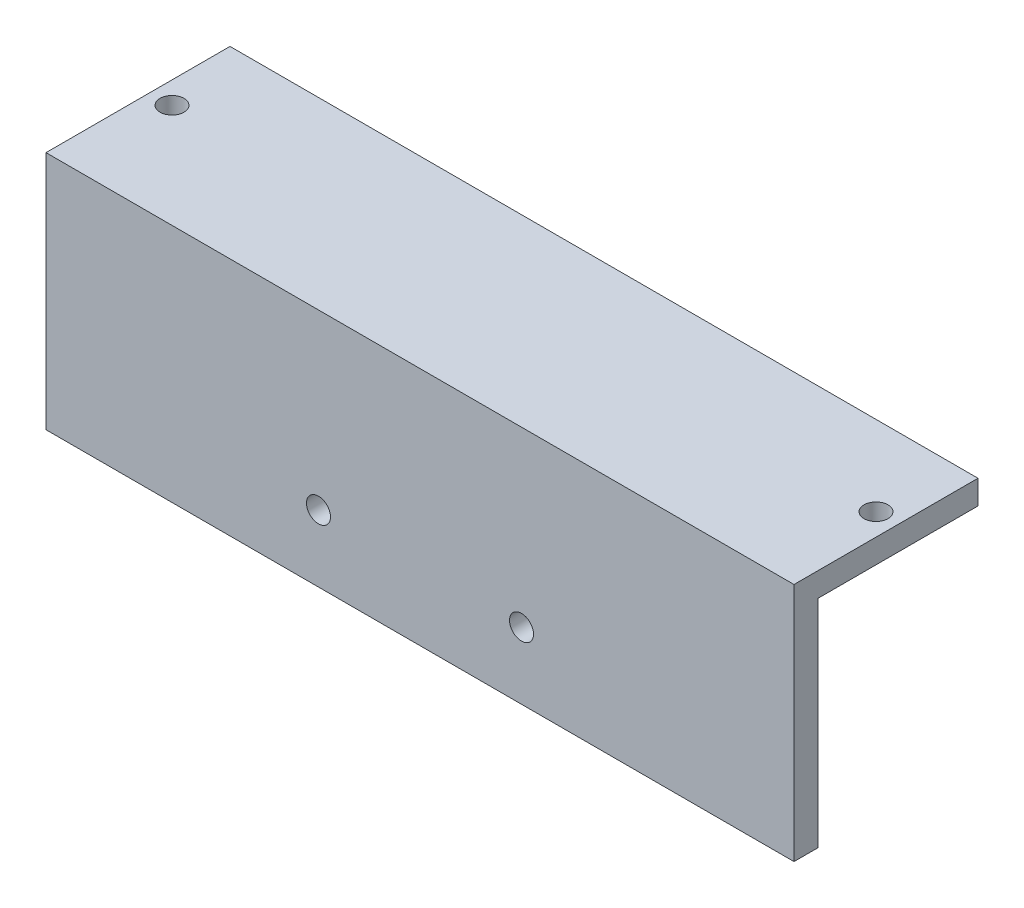
ISO-10303-21;
HEADER;
FILE_DESCRIPTION(('STEP AP214'),'2;1');
FILE_NAME('part.step','',(''),(''),'','','');
FILE_SCHEMA(('AUTOMOTIVE_DESIGN { 1 0 10303 214 1 1 1 1 }'));
ENDSEC;
DATA;
#1=APPLICATION_CONTEXT('core data for automotive mechanical design processes');
#2=APPLICATION_PROTOCOL_DEFINITION('international standard','automotive_design',2000,#1);
#3=PRODUCT_CONTEXT('',#1,'mechanical');
#4=PRODUCT('Part','Part','',(#3));
#5=PRODUCT_RELATED_PRODUCT_CATEGORY('part','',(#4));
#6=PRODUCT_DEFINITION_FORMATION('','',#4);
#7=PRODUCT_DEFINITION_CONTEXT('part definition',#1,'design');
#8=PRODUCT_DEFINITION('design','',#6,#7);
#9=PRODUCT_DEFINITION_SHAPE('','',#8);
#10=(LENGTH_UNIT() NAMED_UNIT(*) SI_UNIT(.MILLI.,.METRE.));
#11=(NAMED_UNIT(*) PLANE_ANGLE_UNIT() SI_UNIT($,.RADIAN.));
#12=(NAMED_UNIT(*) SI_UNIT($,.STERADIAN.) SOLID_ANGLE_UNIT());
#13=UNCERTAINTY_MEASURE_WITH_UNIT(LENGTH_MEASURE(1.E-05),#10,'distance_accuracy_value','');
#14=(GEOMETRIC_REPRESENTATION_CONTEXT(3) GLOBAL_UNCERTAINTY_ASSIGNED_CONTEXT((#13)) GLOBAL_UNIT_ASSIGNED_CONTEXT((#10,
#11,#12)) REPRESENTATION_CONTEXT('',''));
#15=CARTESIAN_POINT('',(0.,0.,0.));
#16=DIRECTION('',(0.,0.,1.));
#17=DIRECTION('',(1.,0.,0.));
#18=AXIS2_PLACEMENT_3D('',#15,#16,#17);
#19=CARTESIAN_POINT('',(0.,0.,0.));
#20=DIRECTION('',(0.,0.,1.));
#21=DIRECTION('',(1.,0.,0.));
#22=AXIS2_PLACEMENT_3D('',#19,#20,#21);
#23=PLANE('',#22);
#24=CARTESIAN_POINT('',(40.8435087719298,-10.3434536390915,0.));
#25=DIRECTION('',(0.,0.,-1.));
#26=DIRECTION('',(-1.,0.,0.));
#27=AXIS2_PLACEMENT_3D('',#24,#25,#26);
#28=CIRCLE('',#27,1.5);
#29=CARTESIAN_POINT('',(39.3435087719298,-10.3434536390915,0.));
#30=VERTEX_POINT('',#29);
#31=EDGE_CURVE('E169',#30,#30,#28,.T.);
#32=ORIENTED_EDGE('',*,*,#31,.F.);
#33=EDGE_LOOP('',(#32));
#34=FACE_BOUND('',#33,.T.);
#35=CARTESIAN_POINT('',(15.4635087719298,-10.3434536390915,0.));
#36=DIRECTION('',(0.,0.,-1.));
#37=DIRECTION('',(-1.,0.,0.));
#38=AXIS2_PLACEMENT_3D('',#35,#36,#37);
#39=CIRCLE('',#38,1.5);
#40=CARTESIAN_POINT('',(13.9635087719298,-10.3434536390915,0.));
#41=VERTEX_POINT('',#40);
#42=EDGE_CURVE('E177',#41,#41,#39,.T.);
#43=ORIENTED_EDGE('',*,*,#42,.F.);
#44=EDGE_LOOP('',(#43));
#45=FACE_BOUND('',#44,.T.);
#46=DIRECTION('',(-1.,0.,0.));
#47=VECTOR('',#46,1.);
#48=CARTESIAN_POINT('',(-18.5964912280702,8.31578947368421,0.));
#49=LINE('',#48,#47);
#50=CARTESIAN_POINT('',(74.9035087719298,8.3157894736842,0.));
#51=VERTEX_POINT('',#50);
#52=CARTESIAN_POINT('',(-18.5964912280702,8.31578947368421,0.));
#53=VERTEX_POINT('',#52);
#54=EDGE_CURVE('E57',#51,#53,#49,.T.);
#55=ORIENTED_EDGE('',*,*,#54,.F.);
#56=DIRECTION('',(0.,1.,0.));
#57=VECTOR('',#56,1.);
#58=CARTESIAN_POINT('',(74.9035087719298,11.3157894736842,0.));
#59=LINE('',#58,#57);
#60=CARTESIAN_POINT('',(74.9035087719298,-18.6842105263158,0.));
#61=VERTEX_POINT('',#60);
#62=EDGE_CURVE('E149',#61,#51,#59,.T.);
#63=ORIENTED_EDGE('',*,*,#62,.F.);
#64=DIRECTION('',(1.,0.,0.));
#65=VECTOR('',#64,1.);
#66=CARTESIAN_POINT('',(-18.5964912280702,-18.6842105263158,0.));
#67=LINE('',#66,#65);
#68=CARTESIAN_POINT('',(-18.5964912280702,-18.6842105263158,0.));
#69=VERTEX_POINT('',#68);
#70=EDGE_CURVE('E81',#69,#61,#67,.T.);
#71=ORIENTED_EDGE('',*,*,#70,.F.);
#72=DIRECTION('',(0.,-1.,0.));
#73=VECTOR('',#72,1.);
#74=CARTESIAN_POINT('',(-18.5964912280702,11.3157894736842,0.));
#75=LINE('',#74,#73);
#76=EDGE_CURVE('E146',#53,#69,#75,.T.);
#77=ORIENTED_EDGE('',*,*,#76,.F.);
#78=EDGE_LOOP('',(#55,#63,#71,#77));
#79=FACE_BOUND('',#78,.T.);
#80=ADVANCED_FACE('F39',(#34,#45,#79),#23,.F.);
#81=CARTESIAN_POINT('',(-18.5964912280702,11.3157894736842,3.));
#82=DIRECTION('',(1.,0.,0.));
#83=DIRECTION('',(0.,1.,0.));
#84=AXIS2_PLACEMENT_3D('',#81,#82,#83);
#85=PLANE('',#84);
#86=DIRECTION('',(0.,0.,-1.));
#87=VECTOR('',#86,1.);
#88=CARTESIAN_POINT('',(-18.5964912280702,11.3157894736842,3.));
#89=LINE('',#88,#87);
#90=CARTESIAN_POINT('',(-18.5964912280702,11.3157894736842,3.));
#91=VERTEX_POINT('',#90);
#92=CARTESIAN_POINT('',(-18.5964912280702,11.3157894736842,-20.));
#93=VERTEX_POINT('',#92);
#94=EDGE_CURVE('E103',#91,#93,#89,.T.);
#95=ORIENTED_EDGE('',*,*,#94,.T.);
#96=DIRECTION('',(0.,1.,0.));
#97=VECTOR('',#96,1.);
#98=CARTESIAN_POINT('',(-18.5964912280702,11.3157894736842,-20.));
#99=LINE('',#98,#97);
#100=CARTESIAN_POINT('',(-18.5964912280702,8.31578947368421,-20.));
#101=VERTEX_POINT('',#100);
#102=EDGE_CURVE('E107',#101,#93,#99,.T.);
#103=ORIENTED_EDGE('',*,*,#102,.F.);
#104=DIRECTION('',(0.,0.,1.));
#105=VECTOR('',#104,1.);
#106=CARTESIAN_POINT('',(-18.5964912280702,8.31578947368421,-20.));
#107=LINE('',#106,#105);
#108=EDGE_CURVE('E138',#101,#53,#107,.T.);
#109=ORIENTED_EDGE('',*,*,#108,.T.);
#110=ORIENTED_EDGE('',*,*,#76,.T.);
#111=DIRECTION('',(0.,0.,-1.));
#112=VECTOR('',#111,1.);
#113=CARTESIAN_POINT('',(-18.5964912280702,-18.6842105263158,3.));
#114=LINE('',#113,#112);
#115=CARTESIAN_POINT('',(-18.5964912280702,-18.6842105263158,3.));
#116=VERTEX_POINT('',#115);
#117=EDGE_CURVE('E11',#116,#69,#114,.T.);
#118=ORIENTED_EDGE('',*,*,#117,.F.);
#119=DIRECTION('',(0.,-1.,0.));
#120=VECTOR('',#119,1.);
#121=CARTESIAN_POINT('',(-18.5964912280702,11.3157894736842,3.));
#122=LINE('',#121,#120);
#123=EDGE_CURVE('E109',#91,#116,#122,.T.);
#124=ORIENTED_EDGE('',*,*,#123,.F.);
#125=EDGE_LOOP('',(#95,#103,#109,#110,#118,#124));
#126=FACE_BOUND('',#125,.T.);
#127=ADVANCED_FACE('F41',(#126),#85,.F.);
#128=CARTESIAN_POINT('',(-18.5964912280702,-18.6842105263158,3.));
#129=DIRECTION('',(0.,1.,0.));
#130=DIRECTION('',(0.,0.,1.));
#131=AXIS2_PLACEMENT_3D('',#128,#129,#130);
#132=PLANE('',#131);
#133=ORIENTED_EDGE('',*,*,#70,.T.);
#134=DIRECTION('',(0.,0.,-1.));
#135=VECTOR('',#134,1.);
#136=CARTESIAN_POINT('',(74.9035087719298,-18.6842105263158,3.));
#137=LINE('',#136,#135);
#138=CARTESIAN_POINT('',(74.9035087719298,-18.6842105263158,3.));
#139=VERTEX_POINT('',#138);
#140=EDGE_CURVE('E49',#139,#61,#137,.T.);
#141=ORIENTED_EDGE('',*,*,#140,.F.);
#142=DIRECTION('',(1.,0.,0.));
#143=VECTOR('',#142,1.);
#144=CARTESIAN_POINT('',(-18.5964912280702,-18.6842105263158,3.));
#145=LINE('',#144,#143);
#146=EDGE_CURVE('E86',#116,#139,#145,.T.);
#147=ORIENTED_EDGE('',*,*,#146,.F.);
#148=ORIENTED_EDGE('',*,*,#117,.T.);
#149=EDGE_LOOP('',(#133,#141,#147,#148));
#150=FACE_BOUND('',#149,.T.);
#151=ADVANCED_FACE('F221',(#150),#132,.F.);
#152=CARTESIAN_POINT('',(74.9035087719298,11.3157894736842,3.));
#153=DIRECTION('',(-1.,0.,0.));
#154=DIRECTION('',(0.,0.,1.));
#155=AXIS2_PLACEMENT_3D('',#152,#153,#154);
#156=PLANE('',#155);
#157=ORIENTED_EDGE('',*,*,#62,.T.);
#158=DIRECTION('',(0.,0.,1.));
#159=VECTOR('',#158,1.);
#160=CARTESIAN_POINT('',(74.9035087719298,8.3157894736842,-20.));
#161=LINE('',#160,#159);
#162=CARTESIAN_POINT('',(74.9035087719298,8.3157894736842,-20.));
#163=VERTEX_POINT('',#162);
#164=EDGE_CURVE('E142',#163,#51,#161,.T.);
#165=ORIENTED_EDGE('',*,*,#164,.F.);
#166=DIRECTION('',(0.,-1.,0.));
#167=VECTOR('',#166,1.);
#168=CARTESIAN_POINT('',(74.9035087719298,11.3157894736842,-20.));
#169=LINE('',#168,#167);
#170=CARTESIAN_POINT('',(74.9035087719298,11.3157894736842,-20.));
#171=VERTEX_POINT('',#170);
#172=EDGE_CURVE('E121',#171,#163,#169,.T.);
#173=ORIENTED_EDGE('',*,*,#172,.F.);
#174=DIRECTION('',(0.,0.,-1.));
#175=VECTOR('',#174,1.);
#176=CARTESIAN_POINT('',(74.9035087719298,11.3157894736842,3.));
#177=LINE('',#176,#175);
#178=CARTESIAN_POINT('',(74.9035087719298,11.3157894736842,3.));
#179=VERTEX_POINT('',#178);
#180=EDGE_CURVE('E112',#179,#171,#177,.T.);
#181=ORIENTED_EDGE('',*,*,#180,.F.);
#182=DIRECTION('',(0.,1.,0.));
#183=VECTOR('',#182,1.);
#184=CARTESIAN_POINT('',(74.9035087719298,11.3157894736842,3.));
#185=LINE('',#184,#183);
#186=EDGE_CURVE('E152',#139,#179,#185,.T.);
#187=ORIENTED_EDGE('',*,*,#186,.F.);
#188=ORIENTED_EDGE('',*,*,#140,.T.);
#189=EDGE_LOOP('',(#157,#165,#173,#181,#187,#188));
#190=FACE_BOUND('',#189,.T.);
#191=ADVANCED_FACE('F229',(#190),#156,.F.);
#192=CARTESIAN_POINT('',(-18.5964912280702,11.3157894736842,3.));
#193=DIRECTION('',(0.,-1.,0.));
#194=DIRECTION('',(0.,0.,-1.));
#195=AXIS2_PLACEMENT_3D('',#192,#193,#194);
#196=PLANE('',#195);
#197=CARTESIAN_POINT('',(-15.8464912280702,11.3157894736842,-10.));
#198=DIRECTION('',(0.,-1.,0.));
#199=DIRECTION('',(0.,0.,-1.));
#200=AXIS2_PLACEMENT_3D('',#197,#198,#199);
#201=CIRCLE('',#200,1.5);
#202=CARTESIAN_POINT('',(-15.8464912280702,11.3157894736842,-11.5));
#203=VERTEX_POINT('',#202);
#204=EDGE_CURVE('E130',#203,#203,#201,.T.);
#205=ORIENTED_EDGE('',*,*,#204,.T.);
#206=EDGE_LOOP('',(#205));
#207=FACE_BOUND('',#206,.T.);
#208=CARTESIAN_POINT('',(72.1535087719298,11.3157894736842,-9.99999999999999));
#209=DIRECTION('',(0.,-1.,0.));
#210=DIRECTION('',(0.,0.,-1.));
#211=AXIS2_PLACEMENT_3D('',#208,#209,#210);
#212=CIRCLE('',#211,1.5);
#213=CARTESIAN_POINT('',(72.1535087719298,11.3157894736842,-11.5));
#214=VERTEX_POINT('',#213);
#215=EDGE_CURVE('E189',#214,#214,#212,.T.);
#216=ORIENTED_EDGE('',*,*,#215,.T.);
#217=EDGE_LOOP('',(#216));
#218=FACE_BOUND('',#217,.T.);
#219=ORIENTED_EDGE('',*,*,#180,.T.);
#220=DIRECTION('',(1.,0.,0.));
#221=VECTOR('',#220,1.);
#222=CARTESIAN_POINT('',(-18.5964912280702,11.3157894736842,-20.));
#223=LINE('',#222,#221);
#224=EDGE_CURVE('E115',#93,#171,#223,.T.);
#225=ORIENTED_EDGE('',*,*,#224,.F.);
#226=ORIENTED_EDGE('',*,*,#94,.F.);
#227=DIRECTION('',(-1.,0.,0.));
#228=VECTOR('',#227,1.);
#229=CARTESIAN_POINT('',(-18.5964912280702,11.3157894736842,3.));
#230=LINE('',#229,#228);
#231=EDGE_CURVE('E66',#179,#91,#230,.T.);
#232=ORIENTED_EDGE('',*,*,#231,.F.);
#233=EDGE_LOOP('',(#219,#225,#226,#232));
#234=FACE_BOUND('',#233,.T.);
#235=ADVANCED_FACE('F116',(#207,#218,#234),#196,.F.);
#236=CARTESIAN_POINT('',(0.,0.,3.));
#237=DIRECTION('',(0.,0.,1.));
#238=DIRECTION('',(1.,0.,0.));
#239=AXIS2_PLACEMENT_3D('',#236,#237,#238);
#240=PLANE('',#239);
#241=CARTESIAN_POINT('',(40.8435087719298,-10.3434536390915,3.));
#242=DIRECTION('',(0.,0.,1.));
#243=DIRECTION('',(1.,0.,0.));
#244=AXIS2_PLACEMENT_3D('',#241,#242,#243);
#245=CIRCLE('',#244,1.5);
#246=CARTESIAN_POINT('',(42.3435087719298,-10.3434536390915,3.));
#247=VERTEX_POINT('',#246);
#248=EDGE_CURVE('E43',#247,#247,#245,.T.);
#249=ORIENTED_EDGE('',*,*,#248,.F.);
#250=EDGE_LOOP('',(#249));
#251=FACE_BOUND('',#250,.T.);
#252=CARTESIAN_POINT('',(15.4635087719298,-10.3434536390915,3.));
#253=DIRECTION('',(0.,0.,1.));
#254=DIRECTION('',(1.,0.,0.));
#255=AXIS2_PLACEMENT_3D('',#252,#253,#254);
#256=CIRCLE('',#255,1.5);
#257=CARTESIAN_POINT('',(16.9635087719298,-10.3434536390915,3.));
#258=VERTEX_POINT('',#257);
#259=EDGE_CURVE('E166',#258,#258,#256,.T.);
#260=ORIENTED_EDGE('',*,*,#259,.F.);
#261=EDGE_LOOP('',(#260));
#262=FACE_BOUND('',#261,.T.);
#263=ORIENTED_EDGE('',*,*,#123,.T.);
#264=ORIENTED_EDGE('',*,*,#146,.T.);
#265=ORIENTED_EDGE('',*,*,#186,.T.);
#266=ORIENTED_EDGE('',*,*,#231,.T.);
#267=EDGE_LOOP('',(#263,#264,#265,#266));
#268=FACE_BOUND('',#267,.T.);
#269=ADVANCED_FACE('F225',(#251,#262,#268),#240,.T.);
#270=CARTESIAN_POINT('',(-18.5964912280702,8.31578947368421,-20.));
#271=DIRECTION('',(0.,1.,0.));
#272=DIRECTION('',(-1.,0.,0.));
#273=AXIS2_PLACEMENT_3D('',#270,#271,#272);
#274=PLANE('',#273);
#275=CARTESIAN_POINT('',(-15.8464912280702,8.31578947368421,-10.));
#276=DIRECTION('',(0.,-1.,0.));
#277=DIRECTION('',(1.,0.,0.));
#278=AXIS2_PLACEMENT_3D('',#275,#276,#277);
#279=CIRCLE('',#278,1.5);
#280=CARTESIAN_POINT('',(-14.3464912280702,8.31578947368421,-10.));
#281=VERTEX_POINT('',#280);
#282=EDGE_CURVE('E185',#281,#281,#279,.T.);
#283=ORIENTED_EDGE('',*,*,#282,.F.);
#284=EDGE_LOOP('',(#283));
#285=FACE_BOUND('',#284,.T.);
#286=CARTESIAN_POINT('',(72.1535087719298,8.3157894736842,-9.99999999999999));
#287=DIRECTION('',(0.,-1.,0.));
#288=DIRECTION('',(1.,0.,0.));
#289=AXIS2_PLACEMENT_3D('',#286,#287,#288);
#290=CIRCLE('',#289,1.5);
#291=CARTESIAN_POINT('',(73.6535087719298,8.3157894736842,-9.99999999999999));
#292=VERTEX_POINT('',#291);
#293=EDGE_CURVE('E175',#292,#292,#290,.T.);
#294=ORIENTED_EDGE('',*,*,#293,.F.);
#295=EDGE_LOOP('',(#294));
#296=FACE_BOUND('',#295,.T.);
#297=ORIENTED_EDGE('',*,*,#54,.T.);
#298=ORIENTED_EDGE('',*,*,#108,.F.);
#299=DIRECTION('',(-1.,0.,0.));
#300=VECTOR('',#299,1.);
#301=CARTESIAN_POINT('',(-18.5964912280702,8.31578947368421,-20.));
#302=LINE('',#301,#300);
#303=EDGE_CURVE('E125',#163,#101,#302,.T.);
#304=ORIENTED_EDGE('',*,*,#303,.F.);
#305=ORIENTED_EDGE('',*,*,#164,.T.);
#306=EDGE_LOOP('',(#297,#298,#304,#305));
#307=FACE_BOUND('',#306,.T.);
#308=ADVANCED_FACE('F253',(#285,#296,#307),#274,.F.);
#309=CARTESIAN_POINT('',(0.,0.,-20.));
#310=DIRECTION('',(0.,0.,1.));
#311=DIRECTION('',(1.,0.,0.));
#312=AXIS2_PLACEMENT_3D('',#309,#310,#311);
#313=PLANE('',#312);
#314=ORIENTED_EDGE('',*,*,#102,.T.);
#315=ORIENTED_EDGE('',*,*,#224,.T.);
#316=ORIENTED_EDGE('',*,*,#172,.T.);
#317=ORIENTED_EDGE('',*,*,#303,.T.);
#318=EDGE_LOOP('',(#314,#315,#316,#317));
#319=FACE_BOUND('',#318,.T.);
#320=ADVANCED_FACE('F123',(#319),#313,.F.);
#321=CARTESIAN_POINT('',(72.1535087719298,28.3157894736842,-9.99999999999999));
#322=DIRECTION('',(0.,-1.,0.));
#323=DIRECTION('',(1.,0.,0.));
#324=AXIS2_PLACEMENT_3D('',#321,#322,#323);
#325=CYLINDRICAL_SURFACE('',#324,1.5);
#326=ORIENTED_EDGE('',*,*,#293,.T.);
#327=EDGE_LOOP('',(#326));
#328=FACE_BOUND('',#327,.T.);
#329=ORIENTED_EDGE('',*,*,#215,.F.);
#330=EDGE_LOOP('',(#329));
#331=FACE_BOUND('',#330,.T.);
#332=ADVANCED_FACE('F204',(#328,#331),#325,.F.);
#333=CARTESIAN_POINT('',(-15.8464912280702,28.3157894736842,-10.));
#334=DIRECTION('',(0.,-1.,0.));
#335=DIRECTION('',(1.,0.,0.));
#336=AXIS2_PLACEMENT_3D('',#333,#334,#335);
#337=CYLINDRICAL_SURFACE('',#336,1.5);
#338=ORIENTED_EDGE('',*,*,#282,.T.);
#339=EDGE_LOOP('',(#338));
#340=FACE_BOUND('',#339,.T.);
#341=ORIENTED_EDGE('',*,*,#204,.F.);
#342=EDGE_LOOP('',(#341));
#343=FACE_BOUND('',#342,.T.);
#344=ADVANCED_FACE('F201',(#340,#343),#337,.F.);
#345=CARTESIAN_POINT('',(15.4635087719298,-10.3434536390915,20.));
#346=DIRECTION('',(0.,0.,-1.));
#347=DIRECTION('',(-1.,0.,0.));
#348=AXIS2_PLACEMENT_3D('',#345,#346,#347);
#349=CYLINDRICAL_SURFACE('',#348,1.5);
#350=ORIENTED_EDGE('',*,*,#259,.T.);
#351=EDGE_LOOP('',(#350));
#352=FACE_BOUND('',#351,.T.);
#353=ORIENTED_EDGE('',*,*,#42,.T.);
#354=EDGE_LOOP('',(#353));
#355=FACE_BOUND('',#354,.T.);
#356=ADVANCED_FACE('F203',(#352,#355),#349,.F.);
#357=CARTESIAN_POINT('',(40.8435087719298,-10.3434536390915,20.));
#358=DIRECTION('',(0.,0.,-1.));
#359=DIRECTION('',(-1.,0.,0.));
#360=AXIS2_PLACEMENT_3D('',#357,#358,#359);
#361=CYLINDRICAL_SURFACE('',#360,1.5);
#362=ORIENTED_EDGE('',*,*,#248,.T.);
#363=EDGE_LOOP('',(#362));
#364=FACE_BOUND('',#363,.T.);
#365=ORIENTED_EDGE('',*,*,#31,.T.);
#366=EDGE_LOOP('',(#365));
#367=FACE_BOUND('',#366,.T.);
#368=ADVANCED_FACE('F211',(#364,#367),#361,.F.);
#369=CLOSED_SHELL('',(#80,#127,#151,#191,#235,#269,#308,#320,#332,#344,#356,#368));
#370=MANIFOLD_SOLID_BREP('B2',#369);
#371=ADVANCED_BREP_SHAPE_REPRESENTATION('',(#18,#370),#14);
#372=SHAPE_DEFINITION_REPRESENTATION(#9,#371);
ENDSEC;
END-ISO-10303-21;
